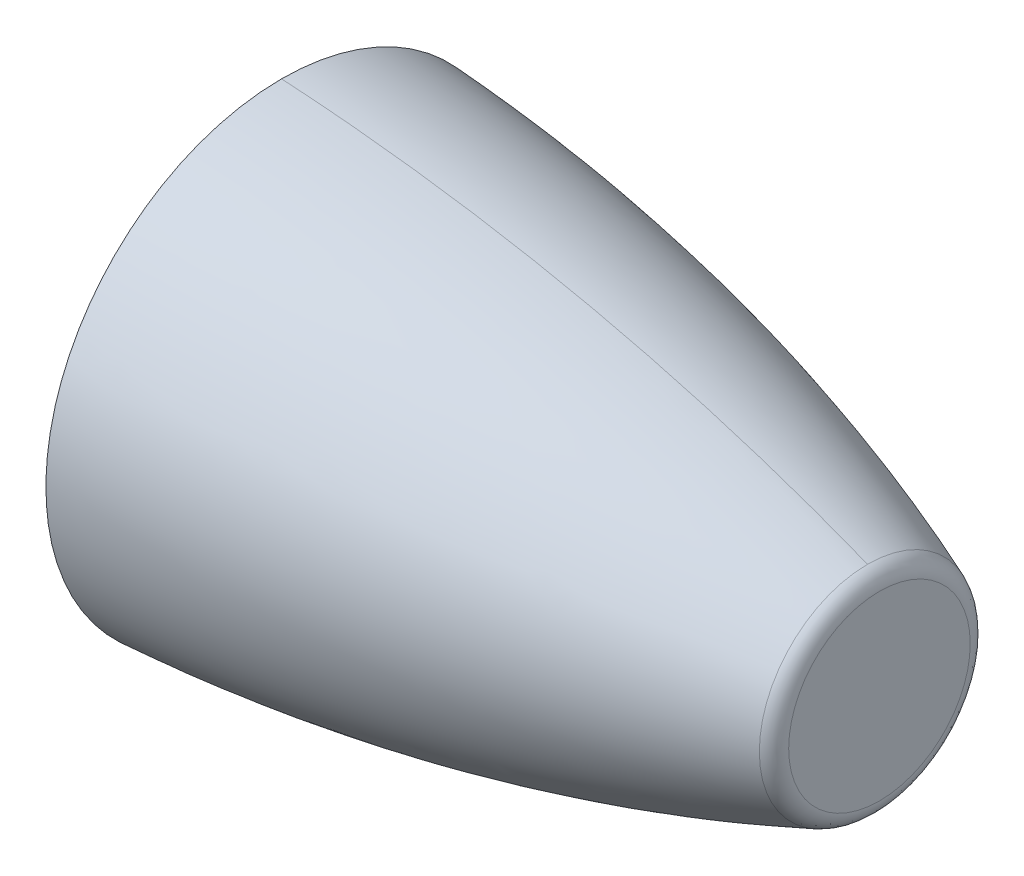
ISO-10303-21;
HEADER;
FILE_DESCRIPTION(('STEP AP214'),'2;1');
FILE_NAME('part.step','',(''),(''),'','','');
FILE_SCHEMA(('AUTOMOTIVE_DESIGN { 1 0 10303 214 1 1 1 1 }'));
ENDSEC;
DATA;
#1=APPLICATION_CONTEXT('core data for automotive mechanical design processes');
#2=APPLICATION_PROTOCOL_DEFINITION('international standard','automotive_design',2000,#1);
#3=PRODUCT_CONTEXT('',#1,'mechanical');
#4=PRODUCT('Part','Part','',(#3));
#5=PRODUCT_RELATED_PRODUCT_CATEGORY('part','',(#4));
#6=PRODUCT_DEFINITION_FORMATION('','',#4);
#7=PRODUCT_DEFINITION_CONTEXT('part definition',#1,'design');
#8=PRODUCT_DEFINITION('design','',#6,#7);
#9=PRODUCT_DEFINITION_SHAPE('','',#8);
#10=(LENGTH_UNIT() NAMED_UNIT(*) SI_UNIT(.MILLI.,.METRE.));
#11=(NAMED_UNIT(*) PLANE_ANGLE_UNIT() SI_UNIT($,.RADIAN.));
#12=(NAMED_UNIT(*) SI_UNIT($,.STERADIAN.) SOLID_ANGLE_UNIT());
#13=UNCERTAINTY_MEASURE_WITH_UNIT(LENGTH_MEASURE(1.E-05),#10,'distance_accuracy_value','');
#14=(GEOMETRIC_REPRESENTATION_CONTEXT(3) GLOBAL_UNCERTAINTY_ASSIGNED_CONTEXT((#13)) GLOBAL_UNIT_ASSIGNED_CONTEXT((#10,
#11,#12)) REPRESENTATION_CONTEXT('',''));
#15=CARTESIAN_POINT('',(0.,0.,0.));
#16=DIRECTION('',(0.,0.,1.));
#17=DIRECTION('',(1.,0.,0.));
#18=AXIS2_PLACEMENT_3D('',#15,#16,#17);
#19=CARTESIAN_POINT('',(12.7,1.5875,0.));
#20=DIRECTION('',(1.,0.,0.));
#21=DIRECTION('',(0.,0.,-1.));
#22=AXIS2_PLACEMENT_3D('',#19,#20,#21);
#23=PLANE('',#22);
#24=CARTESIAN_POINT('',(12.7,0.,0.));
#25=DIRECTION('',(-1.,0.,0.));
#26=DIRECTION('',(0.,0.,1.));
#27=AXIS2_PLACEMENT_3D('',#24,#25,#26);
#28=CIRCLE('',#27,1.5875);
#29=CARTESIAN_POINT('',(12.7,0.,1.5875));
#30=VERTEX_POINT('',#29);
#31=EDGE_CURVE('E61',#30,#30,#28,.F.);
#32=ORIENTED_EDGE('',*,*,#31,.F.);
#33=EDGE_LOOP('',(#32));
#34=FACE_BOUND('',#33,.T.);
#35=ADVANCED_FACE('F16',(#34),#23,.F.);
#36=CARTESIAN_POINT('',(12.7,0.,0.));
#37=DIRECTION('',(-1.,0.,0.));
#38=DIRECTION('',(0.,0.,1.));
#39=AXIS2_PLACEMENT_3D('',#36,#37,#38);
#40=CYLINDRICAL_SURFACE('',#39,1.5875);
#41=CARTESIAN_POINT('',(0.,0.,0.));
#42=DIRECTION('',(-1.,0.,0.));
#43=DIRECTION('',(0.,0.,1.));
#44=AXIS2_PLACEMENT_3D('',#41,#42,#43);
#45=CIRCLE('',#44,1.5875);
#46=CARTESIAN_POINT('',(0.,0.,1.5875));
#47=VERTEX_POINT('',#46);
#48=EDGE_CURVE('E60',#47,#47,#45,.F.);
#49=ORIENTED_EDGE('',*,*,#48,.F.);
#50=EDGE_LOOP('',(#49));
#51=FACE_BOUND('',#50,.T.);
#52=ORIENTED_EDGE('',*,*,#31,.T.);
#53=EDGE_LOOP('',(#52));
#54=FACE_BOUND('',#53,.T.);
#55=ADVANCED_FACE('F77',(#51,#54),#40,.F.);
#56=CARTESIAN_POINT('',(15.875,2.410215906,0.));
#57=DIRECTION('',(-1.,0.,0.));
#58=DIRECTION('',(0.,0.,1.));
#59=AXIS2_PLACEMENT_3D('',#56,#57,#58);
#60=PLANE('',#59);
#61=CARTESIAN_POINT('',(15.8749999940791,0.,0.));
#62=DIRECTION('',(-1.,0.,0.));
#63=DIRECTION('',(0.,-1.11604158024893E-09,1.));
#64=AXIS2_PLACEMENT_3D('',#61,#62,#63);
#65=CIRCLE('',#64,2.410215906);
#66=CARTESIAN_POINT('',(15.8749999960527,-1.79326744564889E-09,2.41021590734495));
#67=VERTEX_POINT('',#66);
#68=CARTESIAN_POINT('',(15.8749999964475,1.07596107965574E-09,-2.41021590653798));
#69=VERTEX_POINT('',#68);
#70=EDGE_CURVE('E47',#67,#69,#65,.T.);
#71=ORIENTED_EDGE('',*,*,#70,.F.);
#72=CARTESIAN_POINT('',(15.8749999940791,0.,0.));
#73=DIRECTION('',(-1.,0.,0.));
#74=DIRECTION('',(0.,1.11604170146806E-09,-1.));
#75=AXIS2_PLACEMENT_3D('',#72,#73,#74);
#76=CIRCLE('',#75,2.4102159086899);
#77=EDGE_CURVE('E51',#69,#67,#76,.T.);
#78=ORIENTED_EDGE('',*,*,#77,.F.);
#79=EDGE_LOOP('',(#71,#78));
#80=FACE_BOUND('',#79,.T.);
#81=ADVANCED_FACE('F59',(#80),#60,.F.);
#82=CARTESIAN_POINT('',(0.,6.2564555338,0.));
#83=DIRECTION('',(1.,0.,0.));
#84=DIRECTION('',(0.,0.,-1.));
#85=AXIS2_PLACEMENT_3D('',#82,#83,#84);
#86=PLANE('',#85);
#87=ORIENTED_EDGE('',*,*,#48,.T.);
#88=EDGE_LOOP('',(#87));
#89=FACE_BOUND('',#88,.T.);
#90=CARTESIAN_POINT('',(0.,-6.2564555338,0.));
#91=CARTESIAN_POINT('',(0.,-6.25647445355018,-0.175964784263323));
#92=CARTESIAN_POINT('',(0.,-6.24903273032447,-0.351926848759574));
#93=CARTESIAN_POINT('',(0.,-6.21936464830104,-0.702592091802602));
#94=CARTESIAN_POINT('',(0.,-6.19713899742058,-0.87729533022244));
#95=CARTESIAN_POINT('',(0.,-6.13806045724832,-1.22408463842572));
#96=CARTESIAN_POINT('',(0.,-6.10121786071352,-1.39617246154858));
#97=CARTESIAN_POINT('',(0.,-6.01317346307233,-1.73663238397285));
#98=CARTESIAN_POINT('',(0.,-5.96197183645352,-1.90500452839949));
#99=CARTESIAN_POINT('',(0.,-5.84555466281274,-2.23688649966549));
#100=CARTESIAN_POINT('',(0.,-5.78033510614399,-2.40039492003424));
#101=CARTESIAN_POINT('',(0.,-5.63632809243167,-2.72139624062622));
#102=CARTESIAN_POINT('',(0.,-5.55753563149266,-2.87888689603568));
#103=CARTESIAN_POINT('',(0.,-5.38700813788586,-3.18658134040888));
#104=CARTESIAN_POINT('',(0.,-5.29528045282454,-3.33678920157818));
#105=CARTESIAN_POINT('',(0.,-5.09946448359522,-3.62900012193742));
#106=CARTESIAN_POINT('',(0.,-4.99537164994421,-3.77100013248627));
#107=CARTESIAN_POINT('',(0.,-4.77563082985129,-4.04567778598531));
#108=CARTESIAN_POINT('',(0.,-4.65998686504169,-4.17835864627106));
#109=CARTESIAN_POINT('',(0.,-4.41789060082836,-4.43355657645353));
#110=CARTESIAN_POINT('',(0.,-4.29143432604668,-4.55606987511949));
#111=CARTESIAN_POINT('',(0.,-4.02867800424835,-4.78998136825377));
#112=CARTESIAN_POINT('',(0.,-3.89238009568498,-4.90138196490757));
#113=CARTESIAN_POINT('',(0.,-3.61083297343187,-5.11234544411362));
#114=CARTESIAN_POINT('',(0.,-3.4655804726789,-5.21190393989262));
#115=CARTESIAN_POINT('',(0.,-3.16726461309534,-5.39838865748549));
#116=CARTESIAN_POINT('',(0.,-3.01420450709254,-5.48532008287735));
#117=CARTESIAN_POINT('',(0.,-2.7012481663183,-5.64601153669094));
#118=CARTESIAN_POINT('',(0.,-2.54134942907897,-5.71976669150048));
#119=CARTESIAN_POINT('',(0.,-2.21597643923793,-5.85351259443965));
#120=CARTESIAN_POINT('',(0.,-2.05050462794108,-5.91350928184141));
#121=CARTESIAN_POINT('',(0.,-1.71503396941451,-6.01937225966206));
#122=CARTESIAN_POINT('',(0.,-1.54503347860854,-6.06523334185439));
#123=CARTESIAN_POINT('',(0.,-1.20180287564837,-6.1424622975569));
#124=CARTESIAN_POINT('',(0.,-1.02857333066588,-6.17383269180798));
#125=CARTESIAN_POINT('',(0.,-0.680083620552781,-6.22186955473425));
#126=CARTESIAN_POINT('',(0.,-0.504823412396316,-6.23853571127555));
#127=CARTESIAN_POINT('',(0.,-0.153519818096818,-6.25704458508185));
#128=CARTESIAN_POINT('',(0.,0.0225235777508405,-6.25888711814981));
#129=CARTESIAN_POINT('',(0.,0.374139794669401,-6.24773516445033));
#130=CARTESIAN_POINT('',(0.,0.549712615738228,-6.23474067761743));
#131=CARTESIAN_POINT('',(0.,0.899139559307782,-6.19400705227867));
#132=CARTESIAN_POINT('',(0.,1.07299368064869,-6.16626790382344));
#133=CARTESIAN_POINT('',(0.,1.41774339589899,-6.09624291536543));
#134=CARTESIAN_POINT('',(0.,1.58863905249583,-6.05395738398582));
#135=CARTESIAN_POINT('',(0.,1.92629306278355,-5.95513063410833));
#136=CARTESIAN_POINT('',(0.,2.09305061827135,-5.89858668840851));
#137=CARTESIAN_POINT('',(0.,2.42114802657535,-5.77167266739676));
#138=CARTESIAN_POINT('',(0.,2.5824898499942,-5.70130768637257));
#139=CARTESIAN_POINT('',(0.,2.89873610192105,-5.54720799085396));
#140=CARTESIAN_POINT('',(0.,3.05363796333327,-5.46346800801448));
#141=CARTESIAN_POINT('',(0.,3.35577905162247,-5.28326714501502));
#142=CARTESIAN_POINT('',(0.,3.50302108520391,-5.18681097074903));
#143=CARTESIAN_POINT('',(0.,3.78890332013428,-4.98180650833661));
#144=CARTESIAN_POINT('',(0.,3.92754075496678,-4.87325436217829));
#145=CARTESIAN_POINT('',(0.,4.19512703855499,-4.64489729337594));
#146=CARTESIAN_POINT('',(0.,4.32407944477974,-4.52509653927398));
#147=CARTESIAN_POINT('',(0.,4.57146495140409,-4.27503033301973));
#148=CARTESIAN_POINT('',(0.,4.68989557709973,-4.14476243266154));
#149=CARTESIAN_POINT('',(0.,4.91531981786986,-3.87476251243222));
#150=CARTESIAN_POINT('',(0.,5.02231763632586,-3.73503400192702));
#151=CARTESIAN_POINT('',(0.,5.22423567220862,-3.44696352565472));
#152=CARTESIAN_POINT('',(0.,5.31914753269545,-3.29861570210301));
#153=CARTESIAN_POINT('',(0.,5.49609945806015,-2.99450560279029));
#154=CARTESIAN_POINT('',(0.,5.57814426147499,-2.83874608420026));
#155=CARTESIAN_POINT('',(0.,5.72889506182234,-2.52071331400332));
#156=CARTESIAN_POINT('',(0.,5.79758788350218,-2.35843381729643));
#157=CARTESIAN_POINT('',(0.,5.92102182863241,-2.02872126630169));
#158=CARTESIAN_POINT('',(0.,5.97576818913761,-1.86129017304605));
#159=CARTESIAN_POINT('',(0.,6.0709004973714,-1.52260062410067));
#160=CARTESIAN_POINT('',(0.,6.11130220077852,-1.35134658860568));
#161=CARTESIAN_POINT('',(0.,6.17752723594736,-1.00611273312501));
#162=CARTESIAN_POINT('',(0.,6.20335772398893,-0.832134294385924));
#163=CARTESIAN_POINT('',(0.,6.2333657235099,-0.548147679429145));
#164=CARTESIAN_POINT('',(0.,6.24202992133497,-0.438594088563115));
#165=CARTESIAN_POINT('',(0.,6.25357067998616,-0.21936413338406));
#166=CARTESIAN_POINT('',(0.,6.2564567849952,-0.109688271435969));
#167=CARTESIAN_POINT('',(0.,6.2564555338,0.));
#168=B_SPLINE_CURVE_WITH_KNOTS('',3,(#90,#91,#92,#93,#94,#95,#96,#97,#98,#99,#100,#101,#102,
#103,#104,#105,#106,#107,#108,#109,#110,#111,#112,#113,#114,#115,#116,#117,#118,#119,#120,#121,
#122,#123,#124,#125,#126,#127,#128,#129,#130,#131,#132,#133,#134,#135,#136,#137,#138,#139,#140,
#141,#142,#143,#144,#145,#146,#147,#148,#149,#150,#151,#152,#153,#154,#155,#156,#157,#158,#159,
#160,#161,#162,#163,#164,#165,#166,#167),.UNSPECIFIED.,.F.,.F.,(4,2,2,2,2,2,2,2,2,2,2,2,2,2,2,2,
2,2,2,2,2,2,2,2,2,2,2,2,2,2,2,2,2,2,2,2,2,2,4),(0.,0.527733226581629,1.05544118487354,
1.58277820679723,2.11010882092239,2.63759047233218,3.16526700717088,3.69264500386009,
4.22021764214177,4.74760723719346,5.27519157911316,5.80266162710595,6.33032646590814,
6.85777323489931,7.38541469272114,7.91282794705272,8.44043529375853,8.96795082544934,
9.4954775546952,10.0230108389316,10.5505441254962,11.0780777680297,11.6056002188424,
12.1332236453255,12.6606529590964,13.1882905392715,13.7157334013348,14.2433449755163,
14.7707617918,15.298302328984,15.8256482385611,16.3533568285557,16.8808706212138,
17.4089023318727,17.936735467363,18.4639870423908,18.9909794453409,19.3205264113204,
19.6495285850599),.UNSPECIFIED.);
#169=CARTESIAN_POINT('',(0.,-6.2564555338,0.));
#170=VERTEX_POINT('',#169);
#171=CARTESIAN_POINT('',(0.,6.2564555338,0.));
#172=VERTEX_POINT('',#171);
#173=EDGE_CURVE('E27',#170,#172,#168,.T.);
#174=ORIENTED_EDGE('',*,*,#173,.F.);
#175=CARTESIAN_POINT('',(0.,6.2564555338,0.));
#176=CARTESIAN_POINT('',(0.,6.25647445355018,0.175964784263323));
#177=CARTESIAN_POINT('',(0.,6.24903273032447,0.351926848759574));
#178=CARTESIAN_POINT('',(0.,6.21936464830104,0.702592091802602));
#179=CARTESIAN_POINT('',(0.,6.19713899742058,0.87729533022244));
#180=CARTESIAN_POINT('',(0.,6.13806045724832,1.22408463842572));
#181=CARTESIAN_POINT('',(0.,6.10121786071352,1.39617246154858));
#182=CARTESIAN_POINT('',(0.,6.01317346307233,1.73663238397285));
#183=CARTESIAN_POINT('',(0.,5.96197183645352,1.90500452839949));
#184=CARTESIAN_POINT('',(0.,5.84555466281274,2.23688649966549));
#185=CARTESIAN_POINT('',(0.,5.78033510614399,2.40039492003424));
#186=CARTESIAN_POINT('',(0.,5.63632809243167,2.72139624062622));
#187=CARTESIAN_POINT('',(0.,5.55753563149266,2.87888689603568));
#188=CARTESIAN_POINT('',(0.,5.38700813788586,3.18658134040888));
#189=CARTESIAN_POINT('',(0.,5.29528045282454,3.33678920157818));
#190=CARTESIAN_POINT('',(0.,5.09946448359522,3.62900012193742));
#191=CARTESIAN_POINT('',(0.,4.99537164994421,3.77100013248627));
#192=CARTESIAN_POINT('',(0.,4.77563082985129,4.04567778598531));
#193=CARTESIAN_POINT('',(0.,4.65998686504169,4.17835864627106));
#194=CARTESIAN_POINT('',(0.,4.41789060082836,4.43355657645353));
#195=CARTESIAN_POINT('',(0.,4.29143432604668,4.55606987511949));
#196=CARTESIAN_POINT('',(0.,4.02867800424835,4.78998136825377));
#197=CARTESIAN_POINT('',(0.,3.89238009568498,4.90138196490757));
#198=CARTESIAN_POINT('',(0.,3.61083297343187,5.11234544411362));
#199=CARTESIAN_POINT('',(0.,3.4655804726789,5.21190393989262));
#200=CARTESIAN_POINT('',(0.,3.16726461309534,5.39838865748549));
#201=CARTESIAN_POINT('',(0.,3.01420450709254,5.48532008287735));
#202=CARTESIAN_POINT('',(0.,2.7012481663183,5.64601153669094));
#203=CARTESIAN_POINT('',(0.,2.54134942907897,5.71976669150048));
#204=CARTESIAN_POINT('',(0.,2.21597643923793,5.85351259443965));
#205=CARTESIAN_POINT('',(0.,2.05050462794108,5.91350928184141));
#206=CARTESIAN_POINT('',(0.,1.71503396941451,6.01937225966206));
#207=CARTESIAN_POINT('',(0.,1.54503347860854,6.06523334185439));
#208=CARTESIAN_POINT('',(0.,1.20180287564837,6.1424622975569));
#209=CARTESIAN_POINT('',(0.,1.02857333066588,6.17383269180798));
#210=CARTESIAN_POINT('',(0.,0.680083620552781,6.22186955473425));
#211=CARTESIAN_POINT('',(0.,0.504823412396316,6.23853571127555));
#212=CARTESIAN_POINT('',(0.,0.153519818096818,6.25704458508185));
#213=CARTESIAN_POINT('',(0.,-0.0225235777508405,6.25888711814981));
#214=CARTESIAN_POINT('',(0.,-0.374139794669401,6.24773516445033));
#215=CARTESIAN_POINT('',(0.,-0.549712615738228,6.23474067761743));
#216=CARTESIAN_POINT('',(0.,-0.899139559307782,6.19400705227867));
#217=CARTESIAN_POINT('',(0.,-1.07299368064869,6.16626790382344));
#218=CARTESIAN_POINT('',(0.,-1.41774339589899,6.09624291536543));
#219=CARTESIAN_POINT('',(0.,-1.58863905249583,6.05395738398582));
#220=CARTESIAN_POINT('',(0.,-1.92629306278355,5.95513063410833));
#221=CARTESIAN_POINT('',(0.,-2.09305061827135,5.89858668840851));
#222=CARTESIAN_POINT('',(0.,-2.42114802657535,5.77167266739676));
#223=CARTESIAN_POINT('',(0.,-2.5824898499942,5.70130768637257));
#224=CARTESIAN_POINT('',(0.,-2.89873610192105,5.54720799085396));
#225=CARTESIAN_POINT('',(0.,-3.05363796333327,5.46346800801448));
#226=CARTESIAN_POINT('',(0.,-3.35577905162247,5.28326714501502));
#227=CARTESIAN_POINT('',(0.,-3.50302108520391,5.18681097074903));
#228=CARTESIAN_POINT('',(0.,-3.78890332013428,4.98180650833661));
#229=CARTESIAN_POINT('',(0.,-3.92754075496678,4.87325436217829));
#230=CARTESIAN_POINT('',(0.,-4.19512703855499,4.64489729337594));
#231=CARTESIAN_POINT('',(0.,-4.32407944477974,4.52509653927398));
#232=CARTESIAN_POINT('',(0.,-4.57146495140409,4.27503033301973));
#233=CARTESIAN_POINT('',(0.,-4.68989557709973,4.14476243266154));
#234=CARTESIAN_POINT('',(0.,-4.91531981786986,3.87476251243222));
#235=CARTESIAN_POINT('',(0.,-5.02231763632586,3.73503400192702));
#236=CARTESIAN_POINT('',(0.,-5.22423567220862,3.44696352565472));
#237=CARTESIAN_POINT('',(0.,-5.31914753269545,3.29861570210301));
#238=CARTESIAN_POINT('',(0.,-5.49609945806015,2.99450560279029));
#239=CARTESIAN_POINT('',(0.,-5.57814426147499,2.83874608420026));
#240=CARTESIAN_POINT('',(0.,-5.72889506182234,2.52071331400332));
#241=CARTESIAN_POINT('',(0.,-5.79758788350218,2.35843381729643));
#242=CARTESIAN_POINT('',(0.,-5.92102182863241,2.02872126630169));
#243=CARTESIAN_POINT('',(0.,-5.97576818913761,1.86129017304605));
#244=CARTESIAN_POINT('',(0.,-6.0709004973714,1.52260062410067));
#245=CARTESIAN_POINT('',(0.,-6.11130220077852,1.35134658860568));
#246=CARTESIAN_POINT('',(0.,-6.17752723594736,1.00611273312501));
#247=CARTESIAN_POINT('',(0.,-6.20335772398893,0.832134294385924));
#248=CARTESIAN_POINT('',(0.,-6.2333657235099,0.548147679429145));
#249=CARTESIAN_POINT('',(0.,-6.24202992133497,0.438594088563115));
#250=CARTESIAN_POINT('',(0.,-6.25357067998616,0.21936413338406));
#251=CARTESIAN_POINT('',(0.,-6.2564567849952,0.109688271435969));
#252=CARTESIAN_POINT('',(0.,-6.2564555338,0.));
#253=B_SPLINE_CURVE_WITH_KNOTS('',3,(#175,#176,#177,#178,#179,#180,#181,#182,#183,#184,#185,
#186,#187,#188,#189,#190,#191,#192,#193,#194,#195,#196,#197,#198,#199,#200,#201,#202,#203,#204,
#205,#206,#207,#208,#209,#210,#211,#212,#213,#214,#215,#216,#217,#218,#219,#220,#221,#222,#223,
#224,#225,#226,#227,#228,#229,#230,#231,#232,#233,#234,#235,#236,#237,#238,#239,#240,#241,#242,
#243,#244,#245,#246,#247,#248,#249,#250,#251,#252),.UNSPECIFIED.,.F.,.F.,(4,2,2,2,2,2,2,2,2,2,2,
2,2,2,2,2,2,2,2,2,2,2,2,2,2,2,2,2,2,2,2,2,2,2,2,2,2,2,4),(0.,0.527733226581629,1.05544118487354,
1.58277820679723,2.11010882092239,2.63759047233218,3.16526700717088,3.69264500386009,
4.22021764214177,4.74760723719346,5.27519157911316,5.80266162710595,6.33032646590814,
6.85777323489931,7.38541469272114,7.91282794705272,8.44043529375853,8.96795082544934,
9.4954775546952,10.0230108389316,10.5505441254962,11.0780777680297,11.6056002188424,
12.1332236453255,12.6606529590964,13.1882905392715,13.7157334013348,14.2433449755163,
14.7707617918,15.298302328984,15.8256482385611,16.3533568285557,16.8808706212138,
17.4089023318727,17.936735467363,18.4639870423908,18.9909794453409,19.3205264113204,
19.6495285850599),.UNSPECIFIED.);
#254=EDGE_CURVE('E55',#172,#170,#253,.T.);
#255=ORIENTED_EDGE('',*,*,#254,.F.);
#256=EDGE_LOOP('',(#174,#255));
#257=FACE_BOUND('',#256,.T.);
#258=ADVANCED_FACE('F76',(#89,#257),#86,.F.);
#259=CARTESIAN_POINT('',(15.5600589992,-2.8747082714,0.));
#260=CARTESIAN_POINT('',(15.5600589992,-2.8747082714,5.7494165682));
#261=CARTESIAN_POINT('',(15.5600589992,2.8747082714,5.7494165682));
#262=CARTESIAN_POINT('',(15.5600589992,2.8747082714,0.));
#263=CARTESIAN_POINT('',(10.506476066,-4.8881128298,0.));
#264=CARTESIAN_POINT('',(10.506476066,-4.8881128298,9.776225685));
#265=CARTESIAN_POINT('',(10.506476066,4.8881128298,9.776225685));
#266=CARTESIAN_POINT('',(10.506476066,4.8881128298,0.));
#267=CARTESIAN_POINT('',(5.1874202576,-5.9502517774,0.));
#268=CARTESIAN_POINT('',(5.1874202576,-5.9502517774,11.9005035802));
#269=CARTESIAN_POINT('',(5.1874202576,5.9502517774,11.9005035802));
#270=CARTESIAN_POINT('',(5.1874202576,5.9502517774,0.));
#271=CARTESIAN_POINT('',(0.,-6.2564555338,0.));
#272=CARTESIAN_POINT('',(0.,-6.2564555338,12.5129110422));
#273=CARTESIAN_POINT('',(0.,6.2564555338,12.5129110422));
#274=CARTESIAN_POINT('',(0.,6.2564555338,0.));
#275=(BOUNDED_SURFACE() B_SPLINE_SURFACE(3,3,((#259,#260,#261,#262),(#263,#264,#265,#266),(#267,
#268,#269,#270),(#271,#272,#273,#274)),.UNSPECIFIED.,.F.,.F.,
.F.) B_SPLINE_SURFACE_WITH_KNOTS((4,4),(4,4),(0.792184650721475,0.959999942128773),(0.,1.),
.UNSPECIFIED.) GEOMETRIC_REPRESENTATION_ITEM() RATIONAL_B_SPLINE_SURFACE(((0.670743740234461,
0.22358124674482,0.22358124674482,0.670743740234461),(0.736121143308546,0.245373714436182,
0.245373714436182,0.736121143308546),(0.820273194402709,0.273424398134236,0.273424398134236,
0.820273194402709),(0.923199893516949,0.307733297838983,0.307733297838983,0.923199893516949))) REPRESENTATION_ITEM('') SURFACE());
#276=CARTESIAN_POINT('',(15.5600589992,2.8747082714,0.));
#277=CARTESIAN_POINT('',(10.506476066,4.8881128298,0.));
#278=CARTESIAN_POINT('',(5.1874202576,5.9502517774,0.));
#279=CARTESIAN_POINT('',(0.,6.2564555338,0.));
#280=(BOUNDED_CURVE() B_SPLINE_CURVE(3,(#276,#277,#278,#279),.UNSPECIFIED.,.F.,
.F.) B_SPLINE_CURVE_WITH_KNOTS((4,4),(0.792184650721475,0.959999942128773),
.UNSPECIFIED.) CURVE() GEOMETRIC_REPRESENTATION_ITEM() RATIONAL_B_SPLINE_CURVE((0.670743740234461,
0.736121143308546,0.820273194402709,0.923199893516949)) REPRESENTATION_ITEM(''));
#281=CARTESIAN_POINT('',(15.5600590021886,2.87470827444297,0.));
#282=VERTEX_POINT('',#281);
#283=EDGE_CURVE('E11',#172,#282,#280,.F.);
#284=CARTESIAN_POINT('',(15.5600589992,-2.8747082714,0.));
#285=CARTESIAN_POINT('',(10.506476066,-4.8881128298,0.));
#286=CARTESIAN_POINT('',(5.1874202576,-5.9502517774,0.));
#287=CARTESIAN_POINT('',(0.,-6.2564555338,0.));
#288=(BOUNDED_CURVE() B_SPLINE_CURVE(3,(#284,#285,#286,#287),.UNSPECIFIED.,.F.,
.F.) B_SPLINE_CURVE_WITH_KNOTS((4,4),(0.792184650721475,0.959999942128773),
.UNSPECIFIED.) CURVE() GEOMETRIC_REPRESENTATION_ITEM() RATIONAL_B_SPLINE_CURVE((0.670743740234461,
0.736121143308546,0.820273194402709,0.923199893516949)) REPRESENTATION_ITEM(''));
#289=CARTESIAN_POINT('',(15.5600589992,-2.8747082714,0.));
#290=VERTEX_POINT('',#289);
#291=EDGE_CURVE('E113',#290,#170,#288,.T.);
#292=CARTESIAN_POINT('',(15.5600590043675,0.,0.));
#293=DIRECTION('',(-1.,0.,0.));
#294=DIRECTION('',(0.,-9.35712751696463E-10,1.));
#295=AXIS2_PLACEMENT_3D('',#292,#293,#294);
#296=CIRCLE('',#295,2.87470828204224);
#297=EDGE_CURVE('E54',#282,#290,#296,.F.);
#298=ORIENTED_EDGE('',*,*,#283,.F.);
#299=ORIENTED_EDGE('',*,*,#254,.T.);
#300=ORIENTED_EDGE('',*,*,#291,.F.);
#301=ORIENTED_EDGE('',*,*,#297,.F.);
#302=EDGE_LOOP('',(#298,#299,#300,#301));
#303=FACE_BOUND('',#302,.T.);
#304=ADVANCED_FACE('F97',(#303),#275,.F.);
#305=CARTESIAN_POINT('',(15.5600590102472,-2.68990119691436E-09,2.87470827969972));
#306=CARTESIAN_POINT('',(15.7563945035726,-2.68990119212478E-09,2.79648600019877));
#307=CARTESIAN_POINT('',(15.8750000012305,-2.68990118141401E-09,2.62156005336712));
#308=CARTESIAN_POINT('',(15.8749999940791,-2.68990116847334E-09,2.4102159005035));
#309=(BOUNDED_CURVE() B_SPLINE_CURVE(3,(#305,#306,#307,#308),.UNSPECIFIED.,.F.,
.F.) B_SPLINE_CURVE_WITH_KNOTS((4,4),(0.,1.),
.UNSPECIFIED.) CURVE() GEOMETRIC_REPRESENTATION_ITEM() RATIONAL_B_SPLINE_CURVE((1.,
0.885121937995927,0.885121937995927,1.)) REPRESENTATION_ITEM(''));
#310=CARTESIAN_POINT('',(15.3750000094,0.,0.));
#311=DIRECTION('',(-1.,0.,0.));
#312=AXIS1_PLACEMENT('',#310,#311);
#313=SURFACE_OF_REVOLUTION('',#309,#312);
#314=CARTESIAN_POINT('',(15.5600589992,0.,0.));
#315=DIRECTION('',(1.,0.,0.));
#316=DIRECTION('',(0.,0.,-1.));
#317=AXIS2_PLACEMENT_3D('',#314,#315,#316);
#318=CIRCLE('',#317,2.8747082714);
#319=EDGE_CURVE('E35',#282,#290,#318,.F.);
#320=ORIENTED_EDGE('',*,*,#319,.F.);
#321=ORIENTED_EDGE('',*,*,#297,.T.);
#322=EDGE_LOOP('',(#320,#321));
#323=FACE_BOUND('',#322,.T.);
#324=ORIENTED_EDGE('',*,*,#70,.T.);
#325=ORIENTED_EDGE('',*,*,#77,.T.);
#326=EDGE_LOOP('',(#324,#325));
#327=FACE_BOUND('',#326,.T.);
#328=ADVANCED_FACE('F50',(#323,#327),#313,.F.);
#329=CARTESIAN_POINT('',(15.5600589992,2.8747082714,0.));
#330=CARTESIAN_POINT('',(15.5600589992,2.8747082714,-5.7494165682));
#331=CARTESIAN_POINT('',(15.5600589992,-2.8747082714,-5.7494165682));
#332=CARTESIAN_POINT('',(15.5600589992,-2.8747082714,0.));
#333=CARTESIAN_POINT('',(10.506476066,4.8881128298,0.));
#334=CARTESIAN_POINT('',(10.506476066,4.8881128298,-9.776225685));
#335=CARTESIAN_POINT('',(10.506476066,-4.8881128298,-9.776225685));
#336=CARTESIAN_POINT('',(10.506476066,-4.8881128298,0.));
#337=CARTESIAN_POINT('',(5.1874202576,5.9502517774,0.));
#338=CARTESIAN_POINT('',(5.1874202576,5.9502517774,-11.9005035802));
#339=CARTESIAN_POINT('',(5.1874202576,-5.9502517774,-11.9005035802));
#340=CARTESIAN_POINT('',(5.1874202576,-5.9502517774,0.));
#341=CARTESIAN_POINT('',(0.,6.2564555338,0.));
#342=CARTESIAN_POINT('',(0.,6.2564555338,-12.5129110422));
#343=CARTESIAN_POINT('',(0.,-6.2564555338,-12.5129110422));
#344=CARTESIAN_POINT('',(0.,-6.2564555338,0.));
#345=(BOUNDED_SURFACE() B_SPLINE_SURFACE(3,3,((#329,#330,#331,#332),(#333,#334,#335,#336),(#337,
#338,#339,#340),(#341,#342,#343,#344)),.UNSPECIFIED.,.F.,.F.,
.F.) B_SPLINE_SURFACE_WITH_KNOTS((4,4),(4,4),(0.792184650721475,0.959999942128773),(0.,1.),
.UNSPECIFIED.) GEOMETRIC_REPRESENTATION_ITEM() RATIONAL_B_SPLINE_SURFACE(((0.670743740234461,
0.22358124674482,0.22358124674482,0.670743740234461),(0.736121143308546,0.245373714436182,
0.245373714436182,0.736121143308546),(0.820273194402709,0.273424398134236,0.273424398134236,
0.820273194402709),(0.923199893516949,0.307733297838983,0.307733297838983,0.923199893516949))) REPRESENTATION_ITEM('') SURFACE());
#346=ORIENTED_EDGE('',*,*,#283,.T.);
#347=ORIENTED_EDGE('',*,*,#319,.T.);
#348=ORIENTED_EDGE('',*,*,#291,.T.);
#349=ORIENTED_EDGE('',*,*,#173,.T.);
#350=EDGE_LOOP('',(#346,#347,#348,#349));
#351=FACE_BOUND('',#350,.T.);
#352=ADVANCED_FACE('F90',(#351),#345,.F.);
#353=CLOSED_SHELL('',(#35,#55,#81,#258,#304,#328,#352));
#354=MANIFOLD_SOLID_BREP('B1',#353);
#355=ADVANCED_BREP_SHAPE_REPRESENTATION('',(#18,#354),#14);
#356=SHAPE_DEFINITION_REPRESENTATION(#9,#355);
ENDSEC;
END-ISO-10303-21;
